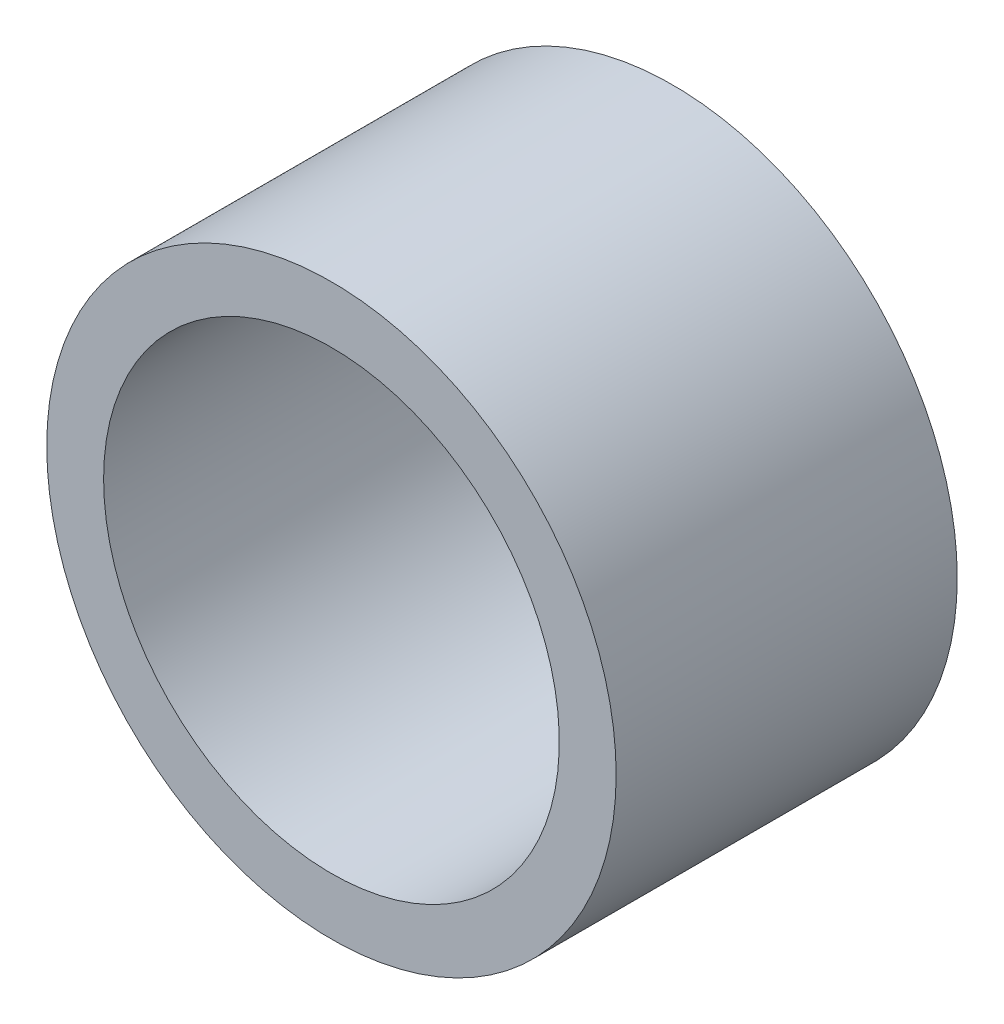
ISO-10303-21;
HEADER;
FILE_DESCRIPTION(('STEP AP214'),'2;1');
FILE_NAME('part.step','',(''),(''),'','','');
FILE_SCHEMA(('AUTOMOTIVE_DESIGN { 1 0 10303 214 1 1 1 1 }'));
ENDSEC;
DATA;
#1=APPLICATION_CONTEXT('core data for automotive mechanical design processes');
#2=APPLICATION_PROTOCOL_DEFINITION('international standard','automotive_design',2000,#1);
#3=PRODUCT_CONTEXT('',#1,'mechanical');
#4=PRODUCT('Part','Part','',(#3));
#5=PRODUCT_RELATED_PRODUCT_CATEGORY('part','',(#4));
#6=PRODUCT_DEFINITION_FORMATION('','',#4);
#7=PRODUCT_DEFINITION_CONTEXT('part definition',#1,'design');
#8=PRODUCT_DEFINITION('design','',#6,#7);
#9=PRODUCT_DEFINITION_SHAPE('','',#8);
#10=(LENGTH_UNIT() NAMED_UNIT(*) SI_UNIT(.MILLI.,.METRE.));
#11=(NAMED_UNIT(*) PLANE_ANGLE_UNIT() SI_UNIT($,.RADIAN.));
#12=(NAMED_UNIT(*) SI_UNIT($,.STERADIAN.) SOLID_ANGLE_UNIT());
#13=UNCERTAINTY_MEASURE_WITH_UNIT(LENGTH_MEASURE(1.E-05),#10,'distance_accuracy_value','');
#14=(GEOMETRIC_REPRESENTATION_CONTEXT(3) GLOBAL_UNCERTAINTY_ASSIGNED_CONTEXT((#13)) GLOBAL_UNIT_ASSIGNED_CONTEXT((#10,
#11,#12)) REPRESENTATION_CONTEXT('',''));
#15=CARTESIAN_POINT('',(0.,0.,0.));
#16=DIRECTION('',(0.,0.,1.));
#17=DIRECTION('',(1.,0.,0.));
#18=AXIS2_PLACEMENT_3D('',#15,#16,#17);
#19=CARTESIAN_POINT('',(0.,0.,9.525));
#20=DIRECTION('',(0.,0.,1.));
#21=DIRECTION('',(1.,0.,0.));
#22=AXIS2_PLACEMENT_3D('',#19,#20,#21);
#23=PLANE('',#22);
#24=CARTESIAN_POINT('',(0.,0.,9.525));
#25=DIRECTION('',(0.,0.,1.));
#26=DIRECTION('',(1.,0.,0.));
#27=AXIS2_PLACEMENT_3D('',#24,#25,#26);
#28=CIRCLE('',#27,15.9004);
#29=CARTESIAN_POINT('',(-15.9004,0.,9.525));
#30=VERTEX_POINT('',#29);
#31=EDGE_CURVE('E10',#30,#30,#28,.T.);
#32=ORIENTED_EDGE('',*,*,#31,.T.);
#33=EDGE_LOOP('',(#32));
#34=FACE_BOUND('',#33,.T.);
#35=CARTESIAN_POINT('',(0.,0.,9.525));
#36=DIRECTION('',(0.,0.,1.));
#37=DIRECTION('',(1.,0.,0.));
#38=AXIS2_PLACEMENT_3D('',#35,#36,#37);
#39=CIRCLE('',#38,12.7254);
#40=CARTESIAN_POINT('',(-12.7254,0.,9.525));
#41=VERTEX_POINT('',#40);
#42=EDGE_CURVE('E52',#41,#41,#39,.T.);
#43=ORIENTED_EDGE('',*,*,#42,.F.);
#44=EDGE_LOOP('',(#43));
#45=FACE_BOUND('',#44,.T.);
#46=ADVANCED_FACE('F41',(#34,#45),#23,.T.);
#47=CARTESIAN_POINT('',(0.,0.,-9.525));
#48=DIRECTION('',(0.,0.,1.));
#49=DIRECTION('',(1.,0.,0.));
#50=AXIS2_PLACEMENT_3D('',#47,#48,#49);
#51=PLANE('',#50);
#52=CARTESIAN_POINT('',(0.,0.,-9.525));
#53=DIRECTION('',(0.,0.,1.));
#54=DIRECTION('',(1.,0.,0.));
#55=AXIS2_PLACEMENT_3D('',#52,#53,#54);
#56=CIRCLE('',#55,15.9004);
#57=CARTESIAN_POINT('',(-15.9004,0.,-9.525));
#58=VERTEX_POINT('',#57);
#59=EDGE_CURVE('E45',#58,#58,#56,.T.);
#60=ORIENTED_EDGE('',*,*,#59,.F.);
#61=EDGE_LOOP('',(#60));
#62=FACE_BOUND('',#61,.T.);
#63=CARTESIAN_POINT('',(0.,0.,-9.525));
#64=DIRECTION('',(0.,0.,1.));
#65=DIRECTION('',(1.,0.,0.));
#66=AXIS2_PLACEMENT_3D('',#63,#64,#65);
#67=CIRCLE('',#66,12.7254);
#68=CARTESIAN_POINT('',(-12.7254,0.,-9.525));
#69=VERTEX_POINT('',#68);
#70=EDGE_CURVE('E54',#69,#69,#67,.T.);
#71=ORIENTED_EDGE('',*,*,#70,.T.);
#72=EDGE_LOOP('',(#71));
#73=FACE_BOUND('',#72,.T.);
#74=ADVANCED_FACE('F64',(#62,#73),#51,.F.);
#75=CARTESIAN_POINT('',(0.,0.,9.525));
#76=DIRECTION('',(0.,0.,-1.));
#77=DIRECTION('',(-1.,0.,0.));
#78=AXIS2_PLACEMENT_3D('',#75,#76,#77);
#79=CYLINDRICAL_SURFACE('',#78,15.9004);
#80=CARTESIAN_POINT('',(-15.9004,0.,9.525));
#81=CARTESIAN_POINT('',(-15.9004,0.,9.3265625));
#82=CARTESIAN_POINT('',(-15.9004,0.,9.128125));
#83=CARTESIAN_POINT('',(-15.9004,0.,8.73125));
#84=CARTESIAN_POINT('',(-15.9004,0.,8.5328125));
#85=CARTESIAN_POINT('',(-15.9004,0.,8.1359375));
#86=CARTESIAN_POINT('',(-15.9004,0.,7.9375));
#87=CARTESIAN_POINT('',(-15.9004,0.,7.540625));
#88=CARTESIAN_POINT('',(-15.9004,0.,7.3421875));
#89=CARTESIAN_POINT('',(-15.9004,0.,6.9453125));
#90=CARTESIAN_POINT('',(-15.9004,0.,6.746875));
#91=CARTESIAN_POINT('',(-15.9004,0.,6.35));
#92=CARTESIAN_POINT('',(-15.9004,0.,6.1515625));
#93=CARTESIAN_POINT('',(-15.9004,0.,5.7546875));
#94=CARTESIAN_POINT('',(-15.9004,0.,5.55625));
#95=CARTESIAN_POINT('',(-15.9004,0.,5.159375));
#96=CARTESIAN_POINT('',(-15.9004,0.,4.9609375));
#97=CARTESIAN_POINT('',(-15.9004,0.,4.5640625));
#98=CARTESIAN_POINT('',(-15.9004,0.,4.365625));
#99=CARTESIAN_POINT('',(-15.9004,0.,3.96875));
#100=CARTESIAN_POINT('',(-15.9004,0.,3.7703125));
#101=CARTESIAN_POINT('',(-15.9004,0.,3.3734375));
#102=CARTESIAN_POINT('',(-15.9004,0.,3.175));
#103=CARTESIAN_POINT('',(-15.9004,0.,2.778125));
#104=CARTESIAN_POINT('',(-15.9004,0.,2.5796875));
#105=CARTESIAN_POINT('',(-15.9004,0.,2.1828125));
#106=CARTESIAN_POINT('',(-15.9004,0.,1.984375));
#107=CARTESIAN_POINT('',(-15.9004,0.,1.5875));
#108=CARTESIAN_POINT('',(-15.9004,0.,1.3890625));
#109=CARTESIAN_POINT('',(-15.9004,0.,0.992187499999999));
#110=CARTESIAN_POINT('',(-15.9004,0.,0.793749999999999));
#111=CARTESIAN_POINT('',(-15.9004,0.,0.396874999999998));
#112=CARTESIAN_POINT('',(-15.9004,0.,0.198437499999998));
#113=CARTESIAN_POINT('',(-15.9004,0.,-0.198437500000002));
#114=CARTESIAN_POINT('',(-15.9004,0.,-0.396875000000002));
#115=CARTESIAN_POINT('',(-15.9004,0.,-0.793750000000002));
#116=CARTESIAN_POINT('',(-15.9004,0.,-0.992187500000002));
#117=CARTESIAN_POINT('',(-15.9004,0.,-1.3890625));
#118=CARTESIAN_POINT('',(-15.9004,0.,-1.5875));
#119=CARTESIAN_POINT('',(-15.9004,0.,-1.984375));
#120=CARTESIAN_POINT('',(-15.9004,0.,-2.1828125));
#121=CARTESIAN_POINT('',(-15.9004,0.,-2.5796875));
#122=CARTESIAN_POINT('',(-15.9004,0.,-2.778125));
#123=CARTESIAN_POINT('',(-15.9004,0.,-3.175));
#124=CARTESIAN_POINT('',(-15.9004,0.,-3.3734375));
#125=CARTESIAN_POINT('',(-15.9004,0.,-3.7703125));
#126=CARTESIAN_POINT('',(-15.9004,0.,-3.96875));
#127=CARTESIAN_POINT('',(-15.9004,0.,-4.365625));
#128=CARTESIAN_POINT('',(-15.9004,0.,-4.5640625));
#129=CARTESIAN_POINT('',(-15.9004,0.,-4.9609375));
#130=CARTESIAN_POINT('',(-15.9004,0.,-5.159375));
#131=CARTESIAN_POINT('',(-15.9004,0.,-5.55625));
#132=CARTESIAN_POINT('',(-15.9004,0.,-5.7546875));
#133=CARTESIAN_POINT('',(-15.9004,0.,-6.1515625));
#134=CARTESIAN_POINT('',(-15.9004,0.,-6.35));
#135=CARTESIAN_POINT('',(-15.9004,0.,-6.746875));
#136=CARTESIAN_POINT('',(-15.9004,0.,-6.9453125));
#137=CARTESIAN_POINT('',(-15.9004,0.,-7.3421875));
#138=CARTESIAN_POINT('',(-15.9004,0.,-7.540625));
#139=CARTESIAN_POINT('',(-15.9004,0.,-7.9375));
#140=CARTESIAN_POINT('',(-15.9004,0.,-8.1359375));
#141=CARTESIAN_POINT('',(-15.9004,0.,-8.5328125));
#142=CARTESIAN_POINT('',(-15.9004,0.,-8.73125));
#143=CARTESIAN_POINT('',(-15.9004,0.,-9.128125));
#144=CARTESIAN_POINT('',(-15.9004,0.,-9.3265625));
#145=CARTESIAN_POINT('',(-15.9004,0.,-9.525));
#146=B_SPLINE_CURVE_WITH_KNOTS('',3,(#80,#81,#82,#83,#84,#85,#86,#87,#88,#89,#90,#91,#92,#93,
#94,#95,#96,#97,#98,#99,#100,#101,#102,#103,#104,#105,#106,#107,#108,#109,#110,#111,#112,#113,
#114,#115,#116,#117,#118,#119,#120,#121,#122,#123,#124,#125,#126,#127,#128,#129,#130,#131,#132,
#133,#134,#135,#136,#137,#138,#139,#140,#141,#142,#143,#144,#145),.UNSPECIFIED.,.F.,.F.,(4,2,2,
2,2,2,2,2,2,2,2,2,2,2,2,2,2,2,2,2,2,2,2,2,2,2,2,2,2,2,2,2,4),(0.,0.595312499999999,1.190625,
1.7859375,2.38125,2.9765625,3.571875,4.1671875,4.7625,5.3578125,5.953125,6.5484375,7.14375,
7.7390625,8.334375,8.9296875,9.525,10.1203125,10.715625,11.3109375,11.90625,12.5015625,
13.096875,13.6921875,14.2875,14.8828125,15.478125,16.0734375,16.66875,17.2640625,17.859375,
18.4546875,19.05),.UNSPECIFIED.);
#147=EDGE_CURVE('BSEAM43',#30,#58,#146,.T.);
#148=ORIENTED_EDGE('',*,*,#31,.F.);
#149=ORIENTED_EDGE('',*,*,#59,.T.);
#150=ORIENTED_EDGE('',*,*,#147,.T.);
#151=ORIENTED_EDGE('',*,*,#147,.F.);
#152=EDGE_LOOP('',(#148,#150,#149,#151));
#153=FACE_BOUND('',#152,.T.);
#154=ADVANCED_FACE('F43',(#153),#79,.T.);
#155=CARTESIAN_POINT('',(0.,0.,9.525));
#156=DIRECTION('',(0.,0.,-1.));
#157=DIRECTION('',(-1.,0.,0.));
#158=AXIS2_PLACEMENT_3D('',#155,#156,#157);
#159=CYLINDRICAL_SURFACE('',#158,12.7254);
#160=CARTESIAN_POINT('',(-12.7254,0.,9.525));
#161=CARTESIAN_POINT('',(-12.7254,0.,9.3265625));
#162=CARTESIAN_POINT('',(-12.7254,0.,9.128125));
#163=CARTESIAN_POINT('',(-12.7254,0.,8.73125));
#164=CARTESIAN_POINT('',(-12.7254,0.,8.5328125));
#165=CARTESIAN_POINT('',(-12.7254,0.,8.1359375));
#166=CARTESIAN_POINT('',(-12.7254,0.,7.9375));
#167=CARTESIAN_POINT('',(-12.7254,0.,7.540625));
#168=CARTESIAN_POINT('',(-12.7254,0.,7.3421875));
#169=CARTESIAN_POINT('',(-12.7254,0.,6.9453125));
#170=CARTESIAN_POINT('',(-12.7254,0.,6.746875));
#171=CARTESIAN_POINT('',(-12.7254,0.,6.35));
#172=CARTESIAN_POINT('',(-12.7254,0.,6.1515625));
#173=CARTESIAN_POINT('',(-12.7254,0.,5.7546875));
#174=CARTESIAN_POINT('',(-12.7254,0.,5.55625));
#175=CARTESIAN_POINT('',(-12.7254,0.,5.159375));
#176=CARTESIAN_POINT('',(-12.7254,0.,4.9609375));
#177=CARTESIAN_POINT('',(-12.7254,0.,4.5640625));
#178=CARTESIAN_POINT('',(-12.7254,0.,4.365625));
#179=CARTESIAN_POINT('',(-12.7254,0.,3.96875));
#180=CARTESIAN_POINT('',(-12.7254,0.,3.7703125));
#181=CARTESIAN_POINT('',(-12.7254,0.,3.3734375));
#182=CARTESIAN_POINT('',(-12.7254,0.,3.175));
#183=CARTESIAN_POINT('',(-12.7254,0.,2.778125));
#184=CARTESIAN_POINT('',(-12.7254,0.,2.5796875));
#185=CARTESIAN_POINT('',(-12.7254,0.,2.1828125));
#186=CARTESIAN_POINT('',(-12.7254,0.,1.984375));
#187=CARTESIAN_POINT('',(-12.7254,0.,1.5875));
#188=CARTESIAN_POINT('',(-12.7254,0.,1.3890625));
#189=CARTESIAN_POINT('',(-12.7254,0.,0.992187500000001));
#190=CARTESIAN_POINT('',(-12.7254,0.,0.793750000000001));
#191=CARTESIAN_POINT('',(-12.7254,0.,0.396875));
#192=CARTESIAN_POINT('',(-12.7254,0.,0.1984375));
#193=CARTESIAN_POINT('',(-12.7254,0.,-0.1984375));
#194=CARTESIAN_POINT('',(-12.7254,0.,-0.396875));
#195=CARTESIAN_POINT('',(-12.7254,0.,-0.793750000000001));
#196=CARTESIAN_POINT('',(-12.7254,0.,-0.992187500000001));
#197=CARTESIAN_POINT('',(-12.7254,0.,-1.3890625));
#198=CARTESIAN_POINT('',(-12.7254,0.,-1.5875));
#199=CARTESIAN_POINT('',(-12.7254,0.,-1.984375));
#200=CARTESIAN_POINT('',(-12.7254,0.,-2.1828125));
#201=CARTESIAN_POINT('',(-12.7254,0.,-2.5796875));
#202=CARTESIAN_POINT('',(-12.7254,0.,-2.778125));
#203=CARTESIAN_POINT('',(-12.7254,0.,-3.175));
#204=CARTESIAN_POINT('',(-12.7254,0.,-3.3734375));
#205=CARTESIAN_POINT('',(-12.7254,0.,-3.7703125));
#206=CARTESIAN_POINT('',(-12.7254,0.,-3.96875));
#207=CARTESIAN_POINT('',(-12.7254,0.,-4.365625));
#208=CARTESIAN_POINT('',(-12.7254,0.,-4.5640625));
#209=CARTESIAN_POINT('',(-12.7254,0.,-4.9609375));
#210=CARTESIAN_POINT('',(-12.7254,0.,-5.159375));
#211=CARTESIAN_POINT('',(-12.7254,0.,-5.55625));
#212=CARTESIAN_POINT('',(-12.7254,0.,-5.7546875));
#213=CARTESIAN_POINT('',(-12.7254,0.,-6.1515625));
#214=CARTESIAN_POINT('',(-12.7254,0.,-6.35));
#215=CARTESIAN_POINT('',(-12.7254,0.,-6.746875));
#216=CARTESIAN_POINT('',(-12.7254,0.,-6.9453125));
#217=CARTESIAN_POINT('',(-12.7254,0.,-7.3421875));
#218=CARTESIAN_POINT('',(-12.7254,0.,-7.540625));
#219=CARTESIAN_POINT('',(-12.7254,0.,-7.9375));
#220=CARTESIAN_POINT('',(-12.7254,0.,-8.1359375));
#221=CARTESIAN_POINT('',(-12.7254,0.,-8.5328125));
#222=CARTESIAN_POINT('',(-12.7254,0.,-8.73125));
#223=CARTESIAN_POINT('',(-12.7254,0.,-9.128125));
#224=CARTESIAN_POINT('',(-12.7254,0.,-9.3265625));
#225=CARTESIAN_POINT('',(-12.7254,0.,-9.525));
#226=B_SPLINE_CURVE_WITH_KNOTS('',3,(#160,#161,#162,#163,#164,#165,#166,#167,#168,#169,#170,
#171,#172,#173,#174,#175,#176,#177,#178,#179,#180,#181,#182,#183,#184,#185,#186,#187,#188,#189,
#190,#191,#192,#193,#194,#195,#196,#197,#198,#199,#200,#201,#202,#203,#204,#205,#206,#207,#208,
#209,#210,#211,#212,#213,#214,#215,#216,#217,#218,#219,#220,#221,#222,#223,#224,#225),
.UNSPECIFIED.,.F.,.F.,(4,2,2,2,2,2,2,2,2,2,2,2,2,2,2,2,2,2,2,2,2,2,2,2,2,2,2,2,2,2,2,2,4),(0.,
0.5953125,1.190625,1.7859375,2.38125,2.9765625,3.571875,4.1671875,4.7625,5.3578125,5.953125,
6.5484375,7.14375,7.7390625,8.334375,8.9296875,9.525,10.1203125,10.715625,11.3109375,11.90625,
12.5015625,13.096875,13.6921875,14.2875,14.8828125,15.478125,16.0734375,16.66875,17.2640625,
17.859375,18.4546875,19.05),.UNSPECIFIED.);
#227=EDGE_CURVE('BSEAM60',#41,#69,#226,.T.);
#228=ORIENTED_EDGE('',*,*,#42,.T.);
#229=ORIENTED_EDGE('',*,*,#70,.F.);
#230=ORIENTED_EDGE('',*,*,#227,.T.);
#231=ORIENTED_EDGE('',*,*,#227,.F.);
#232=EDGE_LOOP('',(#228,#230,#229,#231));
#233=FACE_BOUND('',#232,.T.);
#234=ADVANCED_FACE('F60',(#233),#159,.F.);
#235=CLOSED_SHELL('',(#46,#74,#154,#234));
#236=MANIFOLD_SOLID_BREP('B2',#235);
#237=ADVANCED_BREP_SHAPE_REPRESENTATION('',(#18,#236),#14);
#238=SHAPE_DEFINITION_REPRESENTATION(#9,#237);
ENDSEC;
END-ISO-10303-21;
